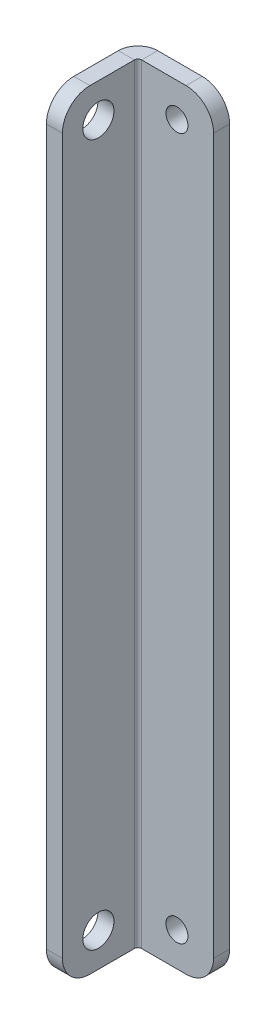
ISO-10303-21;
HEADER;
FILE_DESCRIPTION(('STEP AP214'),'2;1');
FILE_NAME('part.step','',(''),(''),'','','');
FILE_SCHEMA(('AUTOMOTIVE_DESIGN { 1 0 10303 214 1 1 1 1 }'));
ENDSEC;
DATA;
#1=APPLICATION_CONTEXT('core data for automotive mechanical design processes');
#2=APPLICATION_PROTOCOL_DEFINITION('international standard','automotive_design',2000,#1);
#3=PRODUCT_CONTEXT('',#1,'mechanical');
#4=PRODUCT('Part','Part','',(#3));
#5=PRODUCT_RELATED_PRODUCT_CATEGORY('part','',(#4));
#6=PRODUCT_DEFINITION_FORMATION('','',#4);
#7=PRODUCT_DEFINITION_CONTEXT('part definition',#1,'design');
#8=PRODUCT_DEFINITION('design','',#6,#7);
#9=PRODUCT_DEFINITION_SHAPE('','',#8);
#10=(LENGTH_UNIT() NAMED_UNIT(*) SI_UNIT(.MILLI.,.METRE.));
#11=(NAMED_UNIT(*) PLANE_ANGLE_UNIT() SI_UNIT($,.RADIAN.));
#12=(NAMED_UNIT(*) SI_UNIT($,.STERADIAN.) SOLID_ANGLE_UNIT());
#13=UNCERTAINTY_MEASURE_WITH_UNIT(LENGTH_MEASURE(1.E-05),#10,'distance_accuracy_value','');
#14=(GEOMETRIC_REPRESENTATION_CONTEXT(3) GLOBAL_UNCERTAINTY_ASSIGNED_CONTEXT((#13)) GLOBAL_UNIT_ASSIGNED_CONTEXT((#10,
#11,#12)) REPRESENTATION_CONTEXT('',''));
#15=CARTESIAN_POINT('',(0.,0.,0.));
#16=DIRECTION('',(0.,0.,1.));
#17=DIRECTION('',(1.,0.,0.));
#18=AXIS2_PLACEMENT_3D('',#15,#16,#17);
#19=CARTESIAN_POINT('',(0.,0.,-1.75));
#20=DIRECTION('',(0.,-1.,0.));
#21=DIRECTION('',(0.,0.,-1.));
#22=AXIS2_PLACEMENT_3D('',#19,#20,#21);
#23=PLANE('',#22);
#24=DIRECTION('',(1.,0.,0.));
#25=VECTOR('',#24,1.);
#26=CARTESIAN_POINT('',(0.,0.,-1.75));
#27=LINE('',#26,#25);
#28=CARTESIAN_POINT('',(2.15,0.,-1.75));
#29=VERTEX_POINT('',#28);
#30=CARTESIAN_POINT('',(7.,0.,-1.75));
#31=VERTEX_POINT('',#30);
#32=EDGE_CURVE('E217',#29,#31,#27,.T.);
#33=ORIENTED_EDGE('',*,*,#32,.T.);
#34=DIRECTION('',(0.,0.,1.));
#35=VECTOR('',#34,1.);
#36=CARTESIAN_POINT('',(7.,0.,-1.75));
#37=LINE('',#36,#35);
#38=CARTESIAN_POINT('',(7.,0.,0.));
#39=VERTEX_POINT('',#38);
#40=EDGE_CURVE('E245',#31,#39,#37,.T.);
#41=ORIENTED_EDGE('',*,*,#40,.T.);
#42=DIRECTION('',(1.,0.,0.));
#43=VECTOR('',#42,1.);
#44=CARTESIAN_POINT('',(0.,0.,0.));
#45=LINE('',#44,#43);
#46=CARTESIAN_POINT('',(2.15,0.,0.));
#47=VERTEX_POINT('',#46);
#48=EDGE_CURVE('E215',#47,#39,#45,.T.);
#49=ORIENTED_EDGE('',*,*,#48,.F.);
#50=DIRECTION('',(0.,0.,-1.));
#51=VECTOR('',#50,1.);
#52=CARTESIAN_POINT('',(2.15,0.,0.));
#53=LINE('',#52,#51);
#54=EDGE_CURVE('E204',#47,#29,#53,.T.);
#55=ORIENTED_EDGE('',*,*,#54,.T.);
#56=EDGE_LOOP('',(#33,#41,#49,#55));
#57=FACE_BOUND('',#56,.T.);
#58=ADVANCED_FACE('F59',(#57),#23,.T.);
#59=CARTESIAN_POINT('',(0.,0.,-1.75));
#60=DIRECTION('',(0.,0.,-1.));
#61=DIRECTION('',(-1.,0.,0.));
#62=AXIS2_PLACEMENT_3D('',#59,#60,#61);
#63=PLANE('',#62);
#64=CARTESIAN_POINT('',(6.,80.3,-1.75));
#65=DIRECTION('',(0.,0.,-1.));
#66=DIRECTION('',(-1.,0.,0.));
#67=AXIS2_PLACEMENT_3D('',#64,#65,#66);
#68=CIRCLE('',#67,1.2);
#69=CARTESIAN_POINT('',(4.8,80.3,-1.75));
#70=VERTEX_POINT('',#69);
#71=EDGE_CURVE('E461',#70,#70,#68,.T.);
#72=ORIENTED_EDGE('',*,*,#71,.F.);
#73=EDGE_LOOP('',(#72));
#74=FACE_BOUND('',#73,.T.);
#75=CARTESIAN_POINT('',(6.,3.7,-1.75));
#76=DIRECTION('',(0.,0.,-1.));
#77=DIRECTION('',(-1.,0.,0.));
#78=AXIS2_PLACEMENT_3D('',#75,#76,#77);
#79=CIRCLE('',#78,1.2);
#80=CARTESIAN_POINT('',(4.8,3.7,-1.75));
#81=VERTEX_POINT('',#80);
#82=EDGE_CURVE('E464',#81,#81,#79,.T.);
#83=ORIENTED_EDGE('',*,*,#82,.F.);
#84=EDGE_LOOP('',(#83));
#85=FACE_BOUND('',#84,.T.);
#86=DIRECTION('',(0.,1.,0.));
#87=VECTOR('',#86,1.);
#88=CARTESIAN_POINT('',(10.,0.,-1.75));
#89=LINE('',#88,#87);
#90=CARTESIAN_POINT('',(10.,3.,-1.75));
#91=VERTEX_POINT('',#90);
#92=CARTESIAN_POINT('',(10.,81.,-1.75));
#93=VERTEX_POINT('',#92);
#94=EDGE_CURVE('E220',#91,#93,#89,.T.);
#95=ORIENTED_EDGE('',*,*,#94,.F.);
#96=CARTESIAN_POINT('',(7.,3.,-1.75));
#97=DIRECTION('',(0.,0.,-1.));
#98=DIRECTION('',(-1.,0.,0.));
#99=AXIS2_PLACEMENT_3D('',#96,#97,#98);
#100=CIRCLE('',#99,3.);
#101=EDGE_CURVE('E258',#91,#31,#100,.T.);
#102=ORIENTED_EDGE('',*,*,#101,.T.);
#103=ORIENTED_EDGE('',*,*,#32,.F.);
#104=DIRECTION('',(0.,-1.,0.));
#105=VECTOR('',#104,1.);
#106=CARTESIAN_POINT('',(2.15,0.,-1.75));
#107=LINE('',#106,#105);
#108=CARTESIAN_POINT('',(2.15,84.,-1.75));
#109=VERTEX_POINT('',#108);
#110=EDGE_CURVE('E156',#29,#109,#107,.F.);
#111=ORIENTED_EDGE('',*,*,#110,.T.);
#112=DIRECTION('',(-1.,0.,0.));
#113=VECTOR('',#112,1.);
#114=CARTESIAN_POINT('',(0.,84.,-1.75));
#115=LINE('',#114,#113);
#116=CARTESIAN_POINT('',(7.,84.,-1.75));
#117=VERTEX_POINT('',#116);
#118=EDGE_CURVE('E223',#117,#109,#115,.T.);
#119=ORIENTED_EDGE('',*,*,#118,.F.);
#120=CARTESIAN_POINT('',(7.,81.,-1.75));
#121=DIRECTION('',(0.,0.,-1.));
#122=DIRECTION('',(-1.,0.,0.));
#123=AXIS2_PLACEMENT_3D('',#120,#121,#122);
#124=CIRCLE('',#123,3.);
#125=EDGE_CURVE('E79',#117,#93,#124,.T.);
#126=ORIENTED_EDGE('',*,*,#125,.T.);
#127=EDGE_LOOP('',(#95,#102,#103,#111,#119,#126));
#128=FACE_BOUND('',#127,.T.);
#129=ADVANCED_FACE('F279',(#74,#85,#128),#63,.T.);
#130=CARTESIAN_POINT('',(0.,0.,0.));
#131=DIRECTION('',(0.,0.,-1.));
#132=DIRECTION('',(-1.,0.,0.));
#133=AXIS2_PLACEMENT_3D('',#130,#131,#132);
#134=PLANE('',#133);
#135=CARTESIAN_POINT('',(6.,80.3,0.));
#136=DIRECTION('',(0.,0.,-1.));
#137=DIRECTION('',(-1.,0.,0.));
#138=AXIS2_PLACEMENT_3D('',#135,#136,#137);
#139=CIRCLE('',#138,1.2);
#140=CARTESIAN_POINT('',(4.8,80.3,0.));
#141=VERTEX_POINT('',#140);
#142=EDGE_CURVE('E458',#141,#141,#139,.T.);
#143=ORIENTED_EDGE('',*,*,#142,.T.);
#144=EDGE_LOOP('',(#143));
#145=FACE_BOUND('',#144,.T.);
#146=CARTESIAN_POINT('',(6.,3.7,0.));
#147=DIRECTION('',(0.,0.,-1.));
#148=DIRECTION('',(-1.,0.,0.));
#149=AXIS2_PLACEMENT_3D('',#146,#147,#148);
#150=CIRCLE('',#149,1.2);
#151=CARTESIAN_POINT('',(4.8,3.7,0.));
#152=VERTEX_POINT('',#151);
#153=EDGE_CURVE('E201',#152,#152,#150,.T.);
#154=ORIENTED_EDGE('',*,*,#153,.T.);
#155=EDGE_LOOP('',(#154));
#156=FACE_BOUND('',#155,.T.);
#157=ORIENTED_EDGE('',*,*,#48,.T.);
#158=CARTESIAN_POINT('',(7.,3.,0.));
#159=DIRECTION('',(0.,0.,-1.));
#160=DIRECTION('',(-1.,0.,0.));
#161=AXIS2_PLACEMENT_3D('',#158,#159,#160);
#162=CIRCLE('',#161,3.);
#163=CARTESIAN_POINT('',(10.,3.,0.));
#164=VERTEX_POINT('',#163);
#165=EDGE_CURVE('E250',#39,#164,#162,.F.);
#166=ORIENTED_EDGE('',*,*,#165,.T.);
#167=DIRECTION('',(0.,1.,0.));
#168=VECTOR('',#167,1.);
#169=CARTESIAN_POINT('',(10.,0.,0.));
#170=LINE('',#169,#168);
#171=CARTESIAN_POINT('',(10.,81.,0.));
#172=VERTEX_POINT('',#171);
#173=EDGE_CURVE('E228',#164,#172,#170,.T.);
#174=ORIENTED_EDGE('',*,*,#173,.T.);
#175=CARTESIAN_POINT('',(7.,81.,0.));
#176=DIRECTION('',(0.,0.,-1.));
#177=DIRECTION('',(-1.,0.,0.));
#178=AXIS2_PLACEMENT_3D('',#175,#176,#177);
#179=CIRCLE('',#178,3.);
#180=CARTESIAN_POINT('',(7.,84.,0.));
#181=VERTEX_POINT('',#180);
#182=EDGE_CURVE('E248',#172,#181,#179,.F.);
#183=ORIENTED_EDGE('',*,*,#182,.T.);
#184=DIRECTION('',(-1.,0.,0.));
#185=VECTOR('',#184,1.);
#186=CARTESIAN_POINT('',(0.,84.,0.));
#187=LINE('',#186,#185);
#188=CARTESIAN_POINT('',(2.15,84.,0.));
#189=VERTEX_POINT('',#188);
#190=EDGE_CURVE('E221',#181,#189,#187,.T.);
#191=ORIENTED_EDGE('',*,*,#190,.T.);
#192=DIRECTION('',(0.,-1.,0.));
#193=VECTOR('',#192,1.);
#194=CARTESIAN_POINT('',(2.15,0.,0.));
#195=LINE('',#194,#193);
#196=EDGE_CURVE('E208',#47,#189,#195,.F.);
#197=ORIENTED_EDGE('',*,*,#196,.F.);
#198=EDGE_LOOP('',(#157,#166,#174,#183,#191,#197));
#199=FACE_BOUND('',#198,.T.);
#200=ADVANCED_FACE('F288',(#145,#156,#199),#134,.F.);
#201=CARTESIAN_POINT('',(0.,84.,-1.75));
#202=DIRECTION('',(0.,1.,0.));
#203=DIRECTION('',(-1.,0.,0.));
#204=AXIS2_PLACEMENT_3D('',#201,#202,#203);
#205=PLANE('',#204);
#206=ORIENTED_EDGE('',*,*,#190,.F.);
#207=DIRECTION('',(0.,0.,1.));
#208=VECTOR('',#207,1.);
#209=CARTESIAN_POINT('',(7.,84.,-1.75));
#210=LINE('',#209,#208);
#211=EDGE_CURVE('E13',#181,#117,#210,.F.);
#212=ORIENTED_EDGE('',*,*,#211,.T.);
#213=ORIENTED_EDGE('',*,*,#118,.T.);
#214=DIRECTION('',(0.,0.,-1.));
#215=VECTOR('',#214,1.);
#216=CARTESIAN_POINT('',(2.15,84.,0.));
#217=LINE('',#216,#215);
#218=EDGE_CURVE('E212',#189,#109,#217,.T.);
#219=ORIENTED_EDGE('',*,*,#218,.F.);
#220=EDGE_LOOP('',(#206,#212,#213,#219));
#221=FACE_BOUND('',#220,.T.);
#222=ADVANCED_FACE('F278',(#221),#205,.T.);
#223=CARTESIAN_POINT('',(10.,0.,-1.75));
#224=DIRECTION('',(1.,0.,0.));
#225=DIRECTION('',(0.,0.,-1.));
#226=AXIS2_PLACEMENT_3D('',#223,#224,#225);
#227=PLANE('',#226);
#228=ORIENTED_EDGE('',*,*,#173,.F.);
#229=DIRECTION('',(0.,0.,1.));
#230=VECTOR('',#229,1.);
#231=CARTESIAN_POINT('',(10.,3.,-1.75));
#232=LINE('',#231,#230);
#233=EDGE_CURVE('E255',#164,#91,#232,.F.);
#234=ORIENTED_EDGE('',*,*,#233,.T.);
#235=ORIENTED_EDGE('',*,*,#94,.T.);
#236=DIRECTION('',(0.,0.,1.));
#237=VECTOR('',#236,1.);
#238=CARTESIAN_POINT('',(10.,81.,-1.75));
#239=LINE('',#238,#237);
#240=EDGE_CURVE('E252',#93,#172,#239,.T.);
#241=ORIENTED_EDGE('',*,*,#240,.T.);
#242=EDGE_LOOP('',(#228,#234,#235,#241));
#243=FACE_BOUND('',#242,.T.);
#244=ADVANCED_FACE('F285',(#243),#227,.T.);
#245=CARTESIAN_POINT('',(2.15,84.,0.4));
#246=DIRECTION('',(0.,1.,0.));
#247=DIRECTION('',(0.,0.,1.));
#248=AXIS2_PLACEMENT_3D('',#245,#246,#247);
#249=PLANE('',#248);
#250=DIRECTION('',(1.,0.,0.));
#251=VECTOR('',#250,1.);
#252=CARTESIAN_POINT('',(0.,84.,0.399999999999992));
#253=LINE('',#252,#251);
#254=CARTESIAN_POINT('',(1.75,84.,0.399999999999999));
#255=VERTEX_POINT('',#254);
#256=CARTESIAN_POINT('',(0.,84.,0.399999999999992));
#257=VERTEX_POINT('',#256);
#258=EDGE_CURVE('E198',#255,#257,#253,.F.);
#259=ORIENTED_EDGE('',*,*,#258,.F.);
#260=CARTESIAN_POINT('',(2.15,84.,0.4));
#261=DIRECTION('',(0.,-1.,0.));
#262=DIRECTION('',(0.,0.,-1.));
#263=AXIS2_PLACEMENT_3D('',#260,#261,#262);
#264=CIRCLE('',#263,0.4);
#265=EDGE_CURVE('E159',#189,#255,#264,.F.);
#266=ORIENTED_EDGE('',*,*,#265,.F.);
#267=ORIENTED_EDGE('',*,*,#218,.T.);
#268=CARTESIAN_POINT('',(2.15,84.,0.4));
#269=DIRECTION('',(0.,-1.,0.));
#270=DIRECTION('',(0.,0.,-1.));
#271=AXIS2_PLACEMENT_3D('',#268,#269,#270);
#272=CIRCLE('',#271,2.15);
#273=EDGE_CURVE('E203',#109,#257,#272,.F.);
#274=ORIENTED_EDGE('',*,*,#273,.T.);
#275=EDGE_LOOP('',(#259,#266,#267,#274));
#276=FACE_BOUND('',#275,.T.);
#277=ADVANCED_FACE('F277',(#276),#249,.T.);
#278=CARTESIAN_POINT('',(2.15,0.,0.4));
#279=DIRECTION('',(0.,1.,0.));
#280=DIRECTION('',(0.,0.,1.));
#281=AXIS2_PLACEMENT_3D('',#278,#279,#280);
#282=PLANE('',#281);
#283=CARTESIAN_POINT('',(2.15,0.,0.4));
#284=DIRECTION('',(0.,-1.,0.));
#285=DIRECTION('',(0.,0.,-1.));
#286=AXIS2_PLACEMENT_3D('',#283,#284,#285);
#287=CIRCLE('',#286,0.4);
#288=CARTESIAN_POINT('',(1.75,0.,0.399999999999999));
#289=VERTEX_POINT('',#288);
#290=EDGE_CURVE('E166',#289,#47,#287,.T.);
#291=ORIENTED_EDGE('',*,*,#290,.F.);
#292=DIRECTION('',(1.,0.,0.));
#293=VECTOR('',#292,1.);
#294=CARTESIAN_POINT('',(1.75,0.,0.399999999999999));
#295=LINE('',#294,#293);
#296=CARTESIAN_POINT('',(0.,0.,0.399999999999992));
#297=VERTEX_POINT('',#296);
#298=EDGE_CURVE('E163',#289,#297,#295,.F.);
#299=ORIENTED_EDGE('',*,*,#298,.T.);
#300=CARTESIAN_POINT('',(2.15,0.,0.4));
#301=DIRECTION('',(0.,-1.,0.));
#302=DIRECTION('',(0.,0.,-1.));
#303=AXIS2_PLACEMENT_3D('',#300,#301,#302);
#304=CIRCLE('',#303,2.15);
#305=EDGE_CURVE('E148',#297,#29,#304,.T.);
#306=ORIENTED_EDGE('',*,*,#305,.T.);
#307=ORIENTED_EDGE('',*,*,#54,.F.);
#308=EDGE_LOOP('',(#291,#299,#306,#307));
#309=FACE_BOUND('',#308,.T.);
#310=ADVANCED_FACE('F164',(#309),#282,.F.);
#311=CARTESIAN_POINT('',(2.15,0.,0.4));
#312=DIRECTION('',(0.,-1.,0.));
#313=DIRECTION('',(-1.,0.,0.));
#314=AXIS2_PLACEMENT_3D('',#311,#312,#313);
#315=CYLINDRICAL_SURFACE('',#314,2.15);
#316=ORIENTED_EDGE('',*,*,#110,.F.);
#317=ORIENTED_EDGE('',*,*,#305,.F.);
#318=DIRECTION('',(0.,-1.,0.));
#319=VECTOR('',#318,1.);
#320=CARTESIAN_POINT('',(0.,84.,0.399999999999992));
#321=LINE('',#320,#319);
#322=EDGE_CURVE('E153',#297,#257,#321,.F.);
#323=ORIENTED_EDGE('',*,*,#322,.T.);
#324=ORIENTED_EDGE('',*,*,#273,.F.);
#325=EDGE_LOOP('',(#316,#317,#323,#324));
#326=FACE_BOUND('',#325,.T.);
#327=ADVANCED_FACE('F150',(#326),#315,.T.);
#328=CARTESIAN_POINT('',(2.15,0.,0.4));
#329=DIRECTION('',(0.,-1.,0.));
#330=DIRECTION('',(-1.,0.,0.));
#331=AXIS2_PLACEMENT_3D('',#328,#329,#330);
#332=CYLINDRICAL_SURFACE('',#331,0.4);
#333=ORIENTED_EDGE('',*,*,#196,.T.);
#334=ORIENTED_EDGE('',*,*,#265,.T.);
#335=DIRECTION('',(0.,-1.,0.));
#336=VECTOR('',#335,1.);
#337=CARTESIAN_POINT('',(1.75,84.,0.399999999999999));
#338=LINE('',#337,#336);
#339=EDGE_CURVE('E171',#255,#289,#338,.T.);
#340=ORIENTED_EDGE('',*,*,#339,.T.);
#341=ORIENTED_EDGE('',*,*,#290,.T.);
#342=EDGE_LOOP('',(#333,#334,#340,#341));
#343=FACE_BOUND('',#342,.T.);
#344=ADVANCED_FACE('F272',(#343),#332,.F.);
#345=CARTESIAN_POINT('',(0.,0.,8.25));
#346=DIRECTION('',(0.,1.,0.));
#347=DIRECTION('',(0.,0.,1.));
#348=AXIS2_PLACEMENT_3D('',#345,#346,#347);
#349=PLANE('',#348);
#350=DIRECTION('',(0.,0.,-1.));
#351=VECTOR('',#350,1.);
#352=CARTESIAN_POINT('',(1.74999999999997,0.,8.25000000000001));
#353=LINE('',#352,#351);
#354=CARTESIAN_POINT('',(1.74999999999998,0.,5.25000000000001));
#355=VERTEX_POINT('',#354);
#356=EDGE_CURVE('E180',#289,#355,#353,.F.);
#357=ORIENTED_EDGE('',*,*,#356,.T.);
#358=DIRECTION('',(1.,0.,0.));
#359=VECTOR('',#358,1.);
#360=CARTESIAN_POINT('',(0.,0.,5.25));
#361=LINE('',#360,#359);
#362=CARTESIAN_POINT('',(0.,0.,5.25));
#363=VERTEX_POINT('',#362);
#364=EDGE_CURVE('E184',#355,#363,#361,.F.);
#365=ORIENTED_EDGE('',*,*,#364,.T.);
#366=DIRECTION('',(0.,0.,1.));
#367=VECTOR('',#366,1.);
#368=CARTESIAN_POINT('',(0.,0.,0.));
#369=LINE('',#368,#367);
#370=EDGE_CURVE('E176',#297,#363,#369,.T.);
#371=ORIENTED_EDGE('',*,*,#370,.F.);
#372=ORIENTED_EDGE('',*,*,#298,.F.);
#373=EDGE_LOOP('',(#357,#365,#371,#372));
#374=FACE_BOUND('',#373,.T.);
#375=ADVANCED_FACE('F182',(#374),#349,.F.);
#376=CARTESIAN_POINT('',(0.,84.,0.));
#377=DIRECTION('',(0.,-1.,0.));
#378=DIRECTION('',(0.,0.,-1.));
#379=AXIS2_PLACEMENT_3D('',#376,#377,#378);
#380=PLANE('',#379);
#381=DIRECTION('',(0.,0.,-1.));
#382=VECTOR('',#381,1.);
#383=CARTESIAN_POINT('',(0.,84.,0.));
#384=LINE('',#383,#382);
#385=CARTESIAN_POINT('',(0.,84.,5.25));
#386=VERTEX_POINT('',#385);
#387=EDGE_CURVE('E179',#386,#257,#384,.T.);
#388=ORIENTED_EDGE('',*,*,#387,.F.);
#389=DIRECTION('',(1.,0.,0.));
#390=VECTOR('',#389,1.);
#391=CARTESIAN_POINT('',(0.,84.,5.25));
#392=LINE('',#391,#390);
#393=CARTESIAN_POINT('',(1.74999999999998,84.,5.25000000000001));
#394=VERTEX_POINT('',#393);
#395=EDGE_CURVE('E67',#386,#394,#392,.T.);
#396=ORIENTED_EDGE('',*,*,#395,.T.);
#397=DIRECTION('',(0.,0.,1.));
#398=VECTOR('',#397,1.);
#399=CARTESIAN_POINT('',(1.75,84.,0.));
#400=LINE('',#399,#398);
#401=EDGE_CURVE('E186',#394,#255,#400,.F.);
#402=ORIENTED_EDGE('',*,*,#401,.T.);
#403=ORIENTED_EDGE('',*,*,#258,.T.);
#404=EDGE_LOOP('',(#388,#396,#402,#403));
#405=FACE_BOUND('',#404,.T.);
#406=ADVANCED_FACE('F263',(#405),#380,.F.);
#407=CARTESIAN_POINT('',(0.,0.,0.));
#408=DIRECTION('',(1.,0.,0.));
#409=DIRECTION('',(0.,0.,-1.));
#410=AXIS2_PLACEMENT_3D('',#407,#408,#409);
#411=PLANE('',#410);
#412=CARTESIAN_POINT('',(0.,80.3,4.325));
#413=DIRECTION('',(1.,0.,0.));
#414=DIRECTION('',(0.,0.,-1.));
#415=AXIS2_PLACEMENT_3D('',#412,#413,#414);
#416=CIRCLE('',#415,1.69999999999999);
#417=CARTESIAN_POINT('',(0.,80.3,2.625));
#418=VERTEX_POINT('',#417);
#419=EDGE_CURVE('E481',#418,#418,#416,.T.);
#420=ORIENTED_EDGE('',*,*,#419,.T.);
#421=EDGE_LOOP('',(#420));
#422=FACE_BOUND('',#421,.T.);
#423=CARTESIAN_POINT('',(0.,3.7,4.325));
#424=DIRECTION('',(1.,0.,0.));
#425=DIRECTION('',(0.,0.,-1.));
#426=AXIS2_PLACEMENT_3D('',#423,#424,#425);
#427=CIRCLE('',#426,1.7);
#428=CARTESIAN_POINT('',(0.,3.7,2.625));
#429=VERTEX_POINT('',#428);
#430=EDGE_CURVE('E462',#429,#429,#427,.T.);
#431=ORIENTED_EDGE('',*,*,#430,.T.);
#432=EDGE_LOOP('',(#431));
#433=FACE_BOUND('',#432,.T.);
#434=ORIENTED_EDGE('',*,*,#370,.T.);
#435=CARTESIAN_POINT('',(0.,3.,5.25));
#436=DIRECTION('',(1.,0.,0.));
#437=DIRECTION('',(0.,0.,-1.));
#438=AXIS2_PLACEMENT_3D('',#435,#436,#437);
#439=CIRCLE('',#438,3.);
#440=CARTESIAN_POINT('',(0.,3.,8.25));
#441=VERTEX_POINT('',#440);
#442=EDGE_CURVE('E243',#363,#441,#439,.F.);
#443=ORIENTED_EDGE('',*,*,#442,.T.);
#444=DIRECTION('',(0.,1.,0.));
#445=VECTOR('',#444,1.);
#446=CARTESIAN_POINT('',(0.,0.,8.25));
#447=LINE('',#446,#445);
#448=CARTESIAN_POINT('',(0.,81.,8.25));
#449=VERTEX_POINT('',#448);
#450=EDGE_CURVE('E185',#441,#449,#447,.T.);
#451=ORIENTED_EDGE('',*,*,#450,.T.);
#452=CARTESIAN_POINT('',(0.,81.,5.25));
#453=DIRECTION('',(1.,0.,0.));
#454=DIRECTION('',(0.,0.,-1.));
#455=AXIS2_PLACEMENT_3D('',#452,#453,#454);
#456=CIRCLE('',#455,3.);
#457=EDGE_CURVE('E241',#449,#386,#456,.F.);
#458=ORIENTED_EDGE('',*,*,#457,.T.);
#459=ORIENTED_EDGE('',*,*,#387,.T.);
#460=ORIENTED_EDGE('',*,*,#322,.F.);
#461=EDGE_LOOP('',(#434,#443,#451,#458,#459,#460));
#462=FACE_BOUND('',#461,.T.);
#463=ADVANCED_FACE('F175',(#422,#433,#462),#411,.F.);
#464=CARTESIAN_POINT('',(1.75,0.,0.));
#465=DIRECTION('',(1.,0.,0.));
#466=DIRECTION('',(0.,0.,-1.));
#467=AXIS2_PLACEMENT_3D('',#464,#465,#466);
#468=PLANE('',#467);
#469=CARTESIAN_POINT('',(1.74999999999998,80.3,4.325));
#470=DIRECTION('',(1.,0.,0.));
#471=DIRECTION('',(0.,0.,-1.));
#472=AXIS2_PLACEMENT_3D('',#469,#470,#471);
#473=CIRCLE('',#472,1.69999999999999);
#474=CARTESIAN_POINT('',(1.74999999999999,80.3,2.62500000000001));
#475=VERTEX_POINT('',#474);
#476=EDGE_CURVE('E484',#475,#475,#473,.T.);
#477=ORIENTED_EDGE('',*,*,#476,.F.);
#478=EDGE_LOOP('',(#477));
#479=FACE_BOUND('',#478,.T.);
#480=CARTESIAN_POINT('',(1.74999999999998,3.7,4.325));
#481=DIRECTION('',(1.,0.,0.));
#482=DIRECTION('',(0.,0.,-1.));
#483=AXIS2_PLACEMENT_3D('',#480,#481,#482);
#484=CIRCLE('',#483,1.7);
#485=CARTESIAN_POINT('',(1.74999999999999,3.7,2.625));
#486=VERTEX_POINT('',#485);
#487=EDGE_CURVE('E467',#486,#486,#484,.T.);
#488=ORIENTED_EDGE('',*,*,#487,.F.);
#489=EDGE_LOOP('',(#488));
#490=FACE_BOUND('',#489,.T.);
#491=DIRECTION('',(0.,-1.,0.));
#492=VECTOR('',#491,1.);
#493=CARTESIAN_POINT('',(1.74999999999997,84.,8.25000000000001));
#494=LINE('',#493,#492);
#495=CARTESIAN_POINT('',(1.74999999999997,3.,8.25000000000001));
#496=VERTEX_POINT('',#495);
#497=CARTESIAN_POINT('',(1.74999999999997,81.,8.25000000000001));
#498=VERTEX_POINT('',#497);
#499=EDGE_CURVE('E190',#496,#498,#494,.F.);
#500=ORIENTED_EDGE('',*,*,#499,.F.);
#501=CARTESIAN_POINT('',(1.74999999999998,3.,5.25000000000001));
#502=DIRECTION('',(1.,0.,0.));
#503=DIRECTION('',(0.,0.,-1.));
#504=AXIS2_PLACEMENT_3D('',#501,#502,#503);
#505=CIRCLE('',#504,3.);
#506=EDGE_CURVE('E238',#496,#355,#505,.T.);
#507=ORIENTED_EDGE('',*,*,#506,.T.);
#508=ORIENTED_EDGE('',*,*,#356,.F.);
#509=ORIENTED_EDGE('',*,*,#339,.F.);
#510=ORIENTED_EDGE('',*,*,#401,.F.);
#511=CARTESIAN_POINT('',(1.74999999999998,81.,5.25000000000001));
#512=DIRECTION('',(1.,0.,0.));
#513=DIRECTION('',(0.,0.,-1.));
#514=AXIS2_PLACEMENT_3D('',#511,#512,#513);
#515=CIRCLE('',#514,3.);
#516=EDGE_CURVE('E236',#394,#498,#515,.T.);
#517=ORIENTED_EDGE('',*,*,#516,.T.);
#518=EDGE_LOOP('',(#500,#507,#508,#509,#510,#517));
#519=FACE_BOUND('',#518,.T.);
#520=ADVANCED_FACE('F270',(#479,#490,#519),#468,.T.);
#521=CARTESIAN_POINT('',(0.,84.,8.25));
#522=DIRECTION('',(0.,0.,-1.));
#523=DIRECTION('',(-1.,0.,0.));
#524=AXIS2_PLACEMENT_3D('',#521,#522,#523);
#525=PLANE('',#524);
#526=ORIENTED_EDGE('',*,*,#450,.F.);
#527=DIRECTION('',(1.,0.,0.));
#528=VECTOR('',#527,1.);
#529=CARTESIAN_POINT('',(0.,3.,8.25));
#530=LINE('',#529,#528);
#531=EDGE_CURVE('E233',#441,#496,#530,.T.);
#532=ORIENTED_EDGE('',*,*,#531,.T.);
#533=ORIENTED_EDGE('',*,*,#499,.T.);
#534=DIRECTION('',(1.,0.,0.));
#535=VECTOR('',#534,1.);
#536=CARTESIAN_POINT('',(0.,81.,8.25));
#537=LINE('',#536,#535);
#538=EDGE_CURVE('E225',#498,#449,#537,.F.);
#539=ORIENTED_EDGE('',*,*,#538,.T.);
#540=EDGE_LOOP('',(#526,#532,#533,#539));
#541=FACE_BOUND('',#540,.T.);
#542=ADVANCED_FACE('F320',(#541),#525,.F.);
#543=CARTESIAN_POINT('',(6.,3.7,-1.75));
#544=DIRECTION('',(0.,0.,-1.));
#545=DIRECTION('',(-1.,0.,0.));
#546=AXIS2_PLACEMENT_3D('',#543,#544,#545);
#547=CYLINDRICAL_SURFACE('',#546,1.2);
#548=ORIENTED_EDGE('',*,*,#153,.F.);
#549=EDGE_LOOP('',(#548));
#550=FACE_BOUND('',#549,.T.);
#551=ORIENTED_EDGE('',*,*,#82,.T.);
#552=EDGE_LOOP('',(#551));
#553=FACE_BOUND('',#552,.T.);
#554=ADVANCED_FACE('F322',(#550,#553),#547,.F.);
#555=CARTESIAN_POINT('',(6.,80.3,-1.75));
#556=DIRECTION('',(0.,0.,-1.));
#557=DIRECTION('',(-1.,0.,0.));
#558=AXIS2_PLACEMENT_3D('',#555,#556,#557);
#559=CYLINDRICAL_SURFACE('',#558,1.2);
#560=ORIENTED_EDGE('',*,*,#142,.F.);
#561=EDGE_LOOP('',(#560));
#562=FACE_BOUND('',#561,.T.);
#563=ORIENTED_EDGE('',*,*,#71,.T.);
#564=EDGE_LOOP('',(#563));
#565=FACE_BOUND('',#564,.T.);
#566=ADVANCED_FACE('F328',(#562,#565),#559,.F.);
#567=CARTESIAN_POINT('',(1.74999999999998,3.7,4.325));
#568=DIRECTION('',(1.,0.,0.));
#569=DIRECTION('',(0.,0.,-1.));
#570=AXIS2_PLACEMENT_3D('',#567,#568,#569);
#571=CYLINDRICAL_SURFACE('',#570,1.7);
#572=ORIENTED_EDGE('',*,*,#430,.F.);
#573=EDGE_LOOP('',(#572));
#574=FACE_BOUND('',#573,.T.);
#575=ORIENTED_EDGE('',*,*,#487,.T.);
#576=EDGE_LOOP('',(#575));
#577=FACE_BOUND('',#576,.T.);
#578=ADVANCED_FACE('F428',(#574,#577),#571,.F.);
#579=CARTESIAN_POINT('',(1.74999999999998,80.3,4.325));
#580=DIRECTION('',(1.,0.,0.));
#581=DIRECTION('',(0.,0.,-1.));
#582=AXIS2_PLACEMENT_3D('',#579,#580,#581);
#583=CYLINDRICAL_SURFACE('',#582,1.69999999999999);
#584=ORIENTED_EDGE('',*,*,#419,.F.);
#585=EDGE_LOOP('',(#584));
#586=FACE_BOUND('',#585,.T.);
#587=ORIENTED_EDGE('',*,*,#476,.T.);
#588=EDGE_LOOP('',(#587));
#589=FACE_BOUND('',#588,.T.);
#590=ADVANCED_FACE('F308',(#586,#589),#583,.F.);
#591=CARTESIAN_POINT('',(0.,3.,5.25));
#592=DIRECTION('',(1.,0.,0.));
#593=DIRECTION('',(0.,0.,-1.));
#594=AXIS2_PLACEMENT_3D('',#591,#592,#593);
#595=CYLINDRICAL_SURFACE('',#594,3.);
#596=ORIENTED_EDGE('',*,*,#442,.F.);
#597=ORIENTED_EDGE('',*,*,#364,.F.);
#598=ORIENTED_EDGE('',*,*,#506,.F.);
#599=ORIENTED_EDGE('',*,*,#531,.F.);
#600=EDGE_LOOP('',(#596,#597,#598,#599));
#601=FACE_BOUND('',#600,.T.);
#602=ADVANCED_FACE('F305',(#601),#595,.T.);
#603=CARTESIAN_POINT('',(7.,3.,-1.75));
#604=DIRECTION('',(0.,0.,1.));
#605=DIRECTION('',(1.,0.,0.));
#606=AXIS2_PLACEMENT_3D('',#603,#604,#605);
#607=CYLINDRICAL_SURFACE('',#606,3.);
#608=ORIENTED_EDGE('',*,*,#101,.F.);
#609=ORIENTED_EDGE('',*,*,#233,.F.);
#610=ORIENTED_EDGE('',*,*,#165,.F.);
#611=ORIENTED_EDGE('',*,*,#40,.F.);
#612=EDGE_LOOP('',(#608,#609,#610,#611));
#613=FACE_BOUND('',#612,.T.);
#614=ADVANCED_FACE('F293',(#613),#607,.T.);
#615=CARTESIAN_POINT('',(0.,81.,5.25));
#616=DIRECTION('',(1.,0.,0.));
#617=DIRECTION('',(0.,0.,-1.));
#618=AXIS2_PLACEMENT_3D('',#615,#616,#617);
#619=CYLINDRICAL_SURFACE('',#618,3.);
#620=ORIENTED_EDGE('',*,*,#457,.F.);
#621=ORIENTED_EDGE('',*,*,#538,.F.);
#622=ORIENTED_EDGE('',*,*,#516,.F.);
#623=ORIENTED_EDGE('',*,*,#395,.F.);
#624=EDGE_LOOP('',(#620,#621,#622,#623));
#625=FACE_BOUND('',#624,.T.);
#626=ADVANCED_FACE('F311',(#625),#619,.T.);
#627=CARTESIAN_POINT('',(7.,81.,-1.75));
#628=DIRECTION('',(0.,0.,1.));
#629=DIRECTION('',(1.,0.,0.));
#630=AXIS2_PLACEMENT_3D('',#627,#628,#629);
#631=CYLINDRICAL_SURFACE('',#630,3.);
#632=ORIENTED_EDGE('',*,*,#125,.F.);
#633=ORIENTED_EDGE('',*,*,#211,.F.);
#634=ORIENTED_EDGE('',*,*,#182,.F.);
#635=ORIENTED_EDGE('',*,*,#240,.F.);
#636=EDGE_LOOP('',(#632,#633,#634,#635));
#637=FACE_BOUND('',#636,.T.);
#638=ADVANCED_FACE('F61',(#637),#631,.T.);
#639=CLOSED_SHELL('',(#58,#129,#200,#222,#244,#277,#310,#327,#344,#375,#406,#463,#520,#542,#554,
#566,#578,#590,#602,#614,#626,#638));
#640=MANIFOLD_SOLID_BREP('B2',#639);
#641=ADVANCED_BREP_SHAPE_REPRESENTATION('',(#18,#640),#14);
#642=SHAPE_DEFINITION_REPRESENTATION(#9,#641);
ENDSEC;
END-ISO-10303-21;
